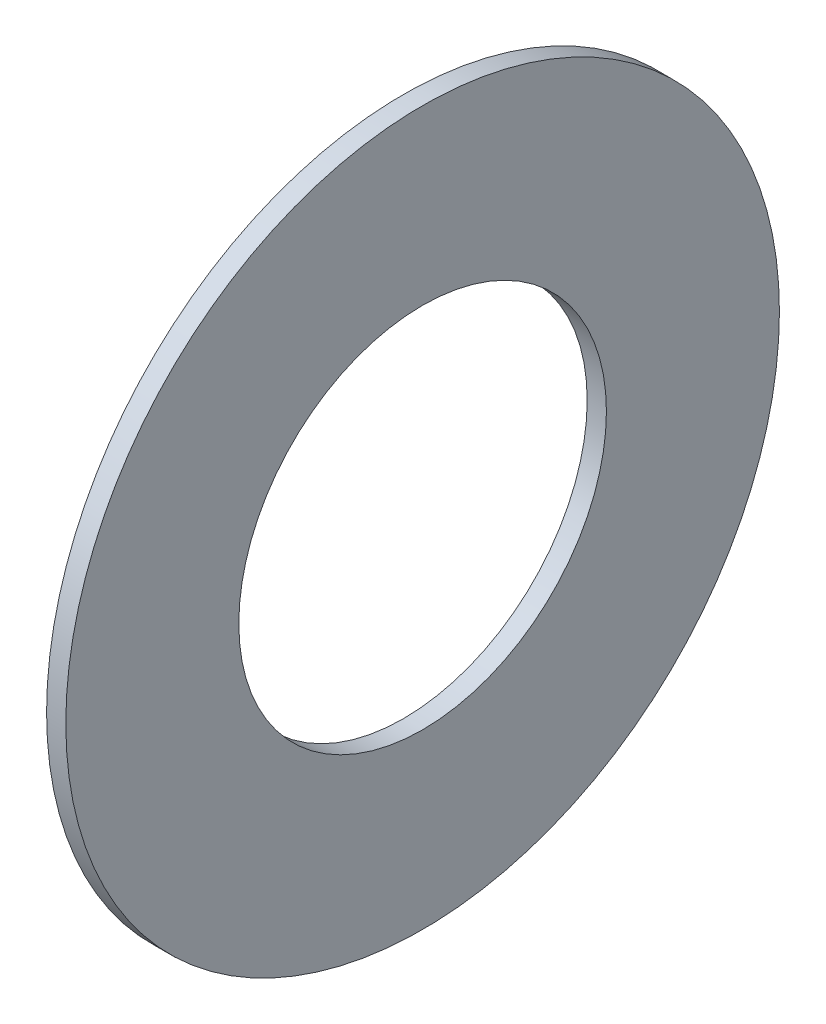
ISO-10303-21;
HEADER;
FILE_DESCRIPTION(('STEP AP214'),'2;1');
FILE_NAME('part.step','',(''),(''),'','','');
FILE_SCHEMA(('AUTOMOTIVE_DESIGN { 1 0 10303 214 1 1 1 1 }'));
ENDSEC;
DATA;
#1=APPLICATION_CONTEXT('core data for automotive mechanical design processes');
#2=APPLICATION_PROTOCOL_DEFINITION('international standard','automotive_design',2000,#1);
#3=PRODUCT_CONTEXT('',#1,'mechanical');
#4=PRODUCT('Part','Part','',(#3));
#5=PRODUCT_RELATED_PRODUCT_CATEGORY('part','',(#4));
#6=PRODUCT_DEFINITION_FORMATION('','',#4);
#7=PRODUCT_DEFINITION_CONTEXT('part definition',#1,'design');
#8=PRODUCT_DEFINITION('design','',#6,#7);
#9=PRODUCT_DEFINITION_SHAPE('','',#8);
#10=(LENGTH_UNIT() NAMED_UNIT(*) SI_UNIT(.MILLI.,.METRE.));
#11=(NAMED_UNIT(*) PLANE_ANGLE_UNIT() SI_UNIT($,.RADIAN.));
#12=(NAMED_UNIT(*) SI_UNIT($,.STERADIAN.) SOLID_ANGLE_UNIT());
#13=UNCERTAINTY_MEASURE_WITH_UNIT(LENGTH_MEASURE(1.E-05),#10,'distance_accuracy_value','');
#14=(GEOMETRIC_REPRESENTATION_CONTEXT(3) GLOBAL_UNCERTAINTY_ASSIGNED_CONTEXT((#13)) GLOBAL_UNIT_ASSIGNED_CONTEXT((#10,
#11,#12)) REPRESENTATION_CONTEXT('',''));
#15=CARTESIAN_POINT('',(0.,0.,0.));
#16=DIRECTION('',(0.,0.,1.));
#17=DIRECTION('',(1.,0.,0.));
#18=AXIS2_PLACEMENT_3D('',#15,#16,#17);
#19=CARTESIAN_POINT('',(0.,0.,0.));
#20=DIRECTION('',(-1.,0.,0.));
#21=DIRECTION('',(0.,0.,1.));
#22=AXIS2_PLACEMENT_3D('',#19,#20,#21);
#23=CYLINDRICAL_SURFACE('',#22,14.85);
#24=CARTESIAN_POINT('',(-0.4,0.,0.));
#25=DIRECTION('',(-1.,0.,0.));
#26=DIRECTION('',(0.,0.,1.));
#27=AXIS2_PLACEMENT_3D('',#24,#25,#26);
#28=CIRCLE('',#27,14.85);
#29=CARTESIAN_POINT('',(-0.4,0.,14.85));
#30=VERTEX_POINT('',#29);
#31=EDGE_CURVE('E10',#30,#30,#28,.T.);
#32=ORIENTED_EDGE('',*,*,#31,.F.);
#33=EDGE_LOOP('',(#32));
#34=FACE_BOUND('',#33,.T.);
#35=CARTESIAN_POINT('',(0.4,0.,0.));
#36=DIRECTION('',(-1.,0.,0.));
#37=DIRECTION('',(0.,0.,1.));
#38=AXIS2_PLACEMENT_3D('',#35,#36,#37);
#39=CIRCLE('',#38,14.85);
#40=CARTESIAN_POINT('',(0.4,0.,14.85));
#41=VERTEX_POINT('',#40);
#42=EDGE_CURVE('E44',#41,#41,#39,.T.);
#43=ORIENTED_EDGE('',*,*,#42,.T.);
#44=EDGE_LOOP('',(#43));
#45=FACE_BOUND('',#44,.T.);
#46=ADVANCED_FACE('F30',(#34,#45),#23,.T.);
#47=CARTESIAN_POINT('',(-0.4,14.85,0.));
#48=DIRECTION('',(1.,0.,0.));
#49=DIRECTION('',(0.,0.,-1.));
#50=AXIS2_PLACEMENT_3D('',#47,#48,#49);
#51=PLANE('',#50);
#52=CARTESIAN_POINT('',(-0.4,0.,0.));
#53=DIRECTION('',(-1.,0.,0.));
#54=DIRECTION('',(0.,0.,1.));
#55=AXIS2_PLACEMENT_3D('',#52,#53,#54);
#56=CIRCLE('',#55,7.65);
#57=CARTESIAN_POINT('',(-0.4,0.,7.65));
#58=VERTEX_POINT('',#57);
#59=EDGE_CURVE('E36',#58,#58,#56,.T.);
#60=ORIENTED_EDGE('',*,*,#59,.F.);
#61=EDGE_LOOP('',(#60));
#62=FACE_BOUND('',#61,.T.);
#63=ORIENTED_EDGE('',*,*,#31,.T.);
#64=EDGE_LOOP('',(#63));
#65=FACE_BOUND('',#64,.T.);
#66=ADVANCED_FACE('F59',(#62,#65),#51,.F.);
#67=CARTESIAN_POINT('',(0.,0.,0.));
#68=DIRECTION('',(-1.,0.,0.));
#69=DIRECTION('',(0.,0.,1.));
#70=AXIS2_PLACEMENT_3D('',#67,#68,#69);
#71=CYLINDRICAL_SURFACE('',#70,7.65);
#72=CARTESIAN_POINT('',(0.4,0.,0.));
#73=DIRECTION('',(-1.,0.,0.));
#74=DIRECTION('',(0.,0.,1.));
#75=AXIS2_PLACEMENT_3D('',#72,#73,#74);
#76=CIRCLE('',#75,7.65);
#77=CARTESIAN_POINT('',(0.4,0.,7.65));
#78=VERTEX_POINT('',#77);
#79=EDGE_CURVE('E40',#78,#78,#76,.T.);
#80=ORIENTED_EDGE('',*,*,#79,.F.);
#81=EDGE_LOOP('',(#80));
#82=FACE_BOUND('',#81,.T.);
#83=ORIENTED_EDGE('',*,*,#59,.T.);
#84=EDGE_LOOP('',(#83));
#85=FACE_BOUND('',#84,.T.);
#86=ADVANCED_FACE('F54',(#82,#85),#71,.F.);
#87=CARTESIAN_POINT('',(0.4,7.65,0.));
#88=DIRECTION('',(-1.,0.,0.));
#89=DIRECTION('',(0.,0.,1.));
#90=AXIS2_PLACEMENT_3D('',#87,#88,#89);
#91=PLANE('',#90);
#92=ORIENTED_EDGE('',*,*,#42,.F.);
#93=EDGE_LOOP('',(#92));
#94=FACE_BOUND('',#93,.T.);
#95=ORIENTED_EDGE('',*,*,#79,.T.);
#96=EDGE_LOOP('',(#95));
#97=FACE_BOUND('',#96,.T.);
#98=ADVANCED_FACE('F51',(#94,#97),#91,.F.);
#99=CLOSED_SHELL('',(#46,#66,#86,#98));
#100=MANIFOLD_SOLID_BREP('B2',#99);
#101=ADVANCED_BREP_SHAPE_REPRESENTATION('',(#18,#100),#14);
#102=SHAPE_DEFINITION_REPRESENTATION(#9,#101);
ENDSEC;
END-ISO-10303-21;
